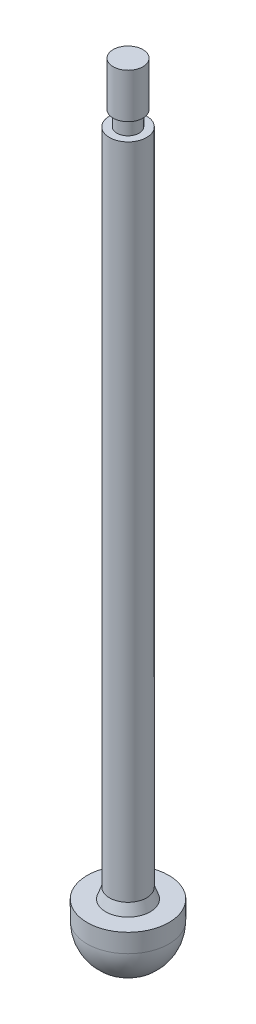
ISO-10303-21;
HEADER;
FILE_DESCRIPTION(('STEP AP214'),'2;1');
FILE_NAME('part.step','',(''),(''),'','','');
FILE_SCHEMA(('AUTOMOTIVE_DESIGN { 1 0 10303 214 1 1 1 1 }'));
ENDSEC;
DATA;
#1=APPLICATION_CONTEXT('core data for automotive mechanical design processes');
#2=APPLICATION_PROTOCOL_DEFINITION('international standard','automotive_design',2000,#1);
#3=PRODUCT_CONTEXT('',#1,'mechanical');
#4=PRODUCT('Part','Part','',(#3));
#5=PRODUCT_RELATED_PRODUCT_CATEGORY('part','',(#4));
#6=PRODUCT_DEFINITION_FORMATION('','',#4);
#7=PRODUCT_DEFINITION_CONTEXT('part definition',#1,'design');
#8=PRODUCT_DEFINITION('design','',#6,#7);
#9=PRODUCT_DEFINITION_SHAPE('','',#8);
#10=(LENGTH_UNIT() NAMED_UNIT(*) SI_UNIT(.MILLI.,.METRE.));
#11=(NAMED_UNIT(*) PLANE_ANGLE_UNIT() SI_UNIT($,.RADIAN.));
#12=(NAMED_UNIT(*) SI_UNIT($,.STERADIAN.) SOLID_ANGLE_UNIT());
#13=UNCERTAINTY_MEASURE_WITH_UNIT(LENGTH_MEASURE(1.E-05),#10,'distance_accuracy_value','');
#14=(GEOMETRIC_REPRESENTATION_CONTEXT(3) GLOBAL_UNCERTAINTY_ASSIGNED_CONTEXT((#13)) GLOBAL_UNIT_ASSIGNED_CONTEXT((#10,
#11,#12)) REPRESENTATION_CONTEXT('',''));
#15=CARTESIAN_POINT('',(0.,0.,0.));
#16=DIRECTION('',(0.,0.,1.));
#17=DIRECTION('',(1.,0.,0.));
#18=AXIS2_PLACEMENT_3D('',#15,#16,#17);
#19=CARTESIAN_POINT('',(0.,2.5,0.));
#20=DIRECTION('',(0.,-1.,0.));
#21=DIRECTION('',(0.,0.,-1.));
#22=AXIS2_PLACEMENT_3D('',#19,#20,#21);
#23=CONICAL_SURFACE('',#22,3.00000000000001,0.349065850398871);
#24=CARTESIAN_POINT('',(0.,3.87373870972729,0.));
#25=DIRECTION('',(0.,-1.,0.));
#26=DIRECTION('',(0.,0.,-1.));
#27=AXIS2_PLACEMENT_3D('',#24,#25,#26);
#28=CIRCLE('',#27,2.50000000000001);
#29=CARTESIAN_POINT('',(0.,3.87373870972729,-2.50000000000001));
#30=VERTEX_POINT('',#29);
#31=EDGE_CURVE('E10',#30,#30,#28,.T.);
#32=ORIENTED_EDGE('',*,*,#31,.T.);
#33=EDGE_LOOP('',(#32));
#34=FACE_BOUND('',#33,.T.);
#35=CARTESIAN_POINT('',(0.,2.5,0.));
#36=DIRECTION('',(0.,-1.,0.));
#37=DIRECTION('',(0.,0.,-1.));
#38=AXIS2_PLACEMENT_3D('',#35,#36,#37);
#39=CIRCLE('',#38,3.00000000000001);
#40=CARTESIAN_POINT('',(0.,2.5,-3.00000000000001));
#41=VERTEX_POINT('',#40);
#42=EDGE_CURVE('E64',#41,#41,#39,.T.);
#43=ORIENTED_EDGE('',*,*,#42,.F.);
#44=EDGE_LOOP('',(#43));
#45=FACE_BOUND('',#44,.T.);
#46=ADVANCED_FACE('F33',(#34,#45),#23,.T.);
#47=CARTESIAN_POINT('',(0.,0.,0.));
#48=DIRECTION('',(0.,-1.,0.));
#49=DIRECTION('',(0.,0.,-1.));
#50=AXIS2_PLACEMENT_3D('',#47,#48,#49);
#51=CYLINDRICAL_SURFACE('',#50,2.50000000000001);
#52=CARTESIAN_POINT('',(0.,92.5,0.));
#53=DIRECTION('',(0.,-1.,0.));
#54=DIRECTION('',(0.,0.,-1.));
#55=AXIS2_PLACEMENT_3D('',#52,#53,#54);
#56=CIRCLE('',#55,2.50000000000001);
#57=CARTESIAN_POINT('',(0.,92.5,-2.50000000000001));
#58=VERTEX_POINT('',#57);
#59=EDGE_CURVE('E39',#58,#58,#56,.T.);
#60=ORIENTED_EDGE('',*,*,#59,.T.);
#61=EDGE_LOOP('',(#60));
#62=FACE_BOUND('',#61,.T.);
#63=ORIENTED_EDGE('',*,*,#31,.F.);
#64=EDGE_LOOP('',(#63));
#65=FACE_BOUND('',#64,.T.);
#66=ADVANCED_FACE('F72',(#62,#65),#51,.T.);
#67=CARTESIAN_POINT('',(2.50000000000001,92.5,0.));
#68=DIRECTION('',(0.,1.,0.));
#69=DIRECTION('',(0.,0.,1.));
#70=AXIS2_PLACEMENT_3D('',#67,#68,#69);
#71=PLANE('',#70);
#72=CARTESIAN_POINT('',(0.,92.5,0.));
#73=DIRECTION('',(0.,-1.,0.));
#74=DIRECTION('',(0.,0.,-1.));
#75=AXIS2_PLACEMENT_3D('',#72,#73,#74);
#76=CIRCLE('',#75,1.5);
#77=CARTESIAN_POINT('',(0.,92.5,-1.5));
#78=VERTEX_POINT('',#77);
#79=EDGE_CURVE('E43',#78,#78,#76,.T.);
#80=ORIENTED_EDGE('',*,*,#79,.T.);
#81=EDGE_LOOP('',(#80));
#82=FACE_BOUND('',#81,.T.);
#83=ORIENTED_EDGE('',*,*,#59,.F.);
#84=EDGE_LOOP('',(#83));
#85=FACE_BOUND('',#84,.T.);
#86=ADVANCED_FACE('F76',(#82,#85),#71,.T.);
#87=CARTESIAN_POINT('',(0.,0.,0.));
#88=DIRECTION('',(0.,-1.,0.));
#89=DIRECTION('',(0.,0.,-1.));
#90=AXIS2_PLACEMENT_3D('',#87,#88,#89);
#91=CYLINDRICAL_SURFACE('',#90,1.5);
#92=CARTESIAN_POINT('',(0.,94.5,0.));
#93=DIRECTION('',(0.,-1.,0.));
#94=DIRECTION('',(0.,0.,-1.));
#95=AXIS2_PLACEMENT_3D('',#92,#93,#94);
#96=CIRCLE('',#95,1.5);
#97=CARTESIAN_POINT('',(0.,94.5,-1.5));
#98=VERTEX_POINT('',#97);
#99=EDGE_CURVE('E47',#98,#98,#96,.T.);
#100=ORIENTED_EDGE('',*,*,#99,.T.);
#101=EDGE_LOOP('',(#100));
#102=FACE_BOUND('',#101,.T.);
#103=ORIENTED_EDGE('',*,*,#79,.F.);
#104=EDGE_LOOP('',(#103));
#105=FACE_BOUND('',#104,.T.);
#106=ADVANCED_FACE('F80',(#102,#105),#91,.T.);
#107=CARTESIAN_POINT('',(1.5,94.5,0.));
#108=DIRECTION('',(0.,-1.,0.));
#109=DIRECTION('',(0.,0.,-1.));
#110=AXIS2_PLACEMENT_3D('',#107,#108,#109);
#111=PLANE('',#110);
#112=CARTESIAN_POINT('',(0.,94.5,0.));
#113=DIRECTION('',(0.,-1.,0.));
#114=DIRECTION('',(0.,0.,-1.));
#115=AXIS2_PLACEMENT_3D('',#112,#113,#114);
#116=CIRCLE('',#115,2.);
#117=CARTESIAN_POINT('',(0.,94.5,-2.));
#118=VERTEX_POINT('',#117);
#119=EDGE_CURVE('E52',#118,#118,#116,.T.);
#120=ORIENTED_EDGE('',*,*,#119,.T.);
#121=EDGE_LOOP('',(#120));
#122=FACE_BOUND('',#121,.T.);
#123=ORIENTED_EDGE('',*,*,#99,.F.);
#124=EDGE_LOOP('',(#123));
#125=FACE_BOUND('',#124,.T.);
#126=ADVANCED_FACE('F87',(#122,#125),#111,.T.);
#127=CARTESIAN_POINT('',(0.,0.,0.));
#128=DIRECTION('',(0.,-1.,0.));
#129=DIRECTION('',(0.,0.,-1.));
#130=AXIS2_PLACEMENT_3D('',#127,#128,#129);
#131=CYLINDRICAL_SURFACE('',#130,2.);
#132=CARTESIAN_POINT('',(0.,100.5,0.));
#133=DIRECTION('',(0.,-1.,0.));
#134=DIRECTION('',(0.,0.,-1.));
#135=AXIS2_PLACEMENT_3D('',#132,#133,#134);
#136=CIRCLE('',#135,2.);
#137=CARTESIAN_POINT('',(0.,100.5,-2.));
#138=VERTEX_POINT('',#137);
#139=EDGE_CURVE('E55',#138,#138,#136,.T.);
#140=ORIENTED_EDGE('',*,*,#139,.T.);
#141=EDGE_LOOP('',(#140));
#142=FACE_BOUND('',#141,.T.);
#143=ORIENTED_EDGE('',*,*,#119,.F.);
#144=EDGE_LOOP('',(#143));
#145=FACE_BOUND('',#144,.T.);
#146=ADVANCED_FACE('F91',(#142,#145),#131,.T.);
#147=CARTESIAN_POINT('',(2.,100.5,0.));
#148=DIRECTION('',(0.,1.,0.));
#149=DIRECTION('',(0.,0.,1.));
#150=AXIS2_PLACEMENT_3D('',#147,#148,#149);
#151=PLANE('',#150);
#152=ORIENTED_EDGE('',*,*,#139,.F.);
#153=EDGE_LOOP('',(#152));
#154=FACE_BOUND('',#153,.T.);
#155=ADVANCED_FACE('F95',(#154),#151,.T.);
#156=CARTESIAN_POINT('',(0.,0.,0.));
#157=DIRECTION('',(0.,-1.,0.));
#158=DIRECTION('',(-1.,0.,0.));
#159=AXIS2_PLACEMENT_3D('',#156,#157,#158);
#160=SPHERICAL_SURFACE('',#159,5.5);
#161=CARTESIAN_POINT('',(0.,0.,0.));
#162=DIRECTION('',(0.,-1.,0.));
#163=DIRECTION('',(0.,0.,-1.));
#164=AXIS2_PLACEMENT_3D('',#161,#162,#163);
#165=CIRCLE('',#164,5.5);
#166=CARTESIAN_POINT('',(0.,0.,-5.5));
#167=VERTEX_POINT('',#166);
#168=EDGE_CURVE('E58',#167,#167,#165,.T.);
#169=ORIENTED_EDGE('',*,*,#168,.T.);
#170=EDGE_LOOP('',(#169));
#171=FACE_BOUND('',#170,.T.);
#172=ADVANCED_FACE('F99',(#171),#160,.T.);
#173=CARTESIAN_POINT('',(0.,0.,0.));
#174=DIRECTION('',(0.,-1.,0.));
#175=DIRECTION('',(0.,0.,-1.));
#176=AXIS2_PLACEMENT_3D('',#173,#174,#175);
#177=CYLINDRICAL_SURFACE('',#176,5.5);
#178=CARTESIAN_POINT('',(0.,2.5,0.));
#179=DIRECTION('',(0.,-1.,0.));
#180=DIRECTION('',(0.,0.,-1.));
#181=AXIS2_PLACEMENT_3D('',#178,#179,#180);
#182=CIRCLE('',#181,5.5);
#183=CARTESIAN_POINT('',(0.,2.5,-5.5));
#184=VERTEX_POINT('',#183);
#185=EDGE_CURVE('E61',#184,#184,#182,.T.);
#186=ORIENTED_EDGE('',*,*,#185,.T.);
#187=EDGE_LOOP('',(#186));
#188=FACE_BOUND('',#187,.T.);
#189=ORIENTED_EDGE('',*,*,#168,.F.);
#190=EDGE_LOOP('',(#189));
#191=FACE_BOUND('',#190,.T.);
#192=ADVANCED_FACE('F103',(#188,#191),#177,.T.);
#193=CARTESIAN_POINT('',(5.5,2.5,0.));
#194=DIRECTION('',(0.,1.,0.));
#195=DIRECTION('',(0.,0.,1.));
#196=AXIS2_PLACEMENT_3D('',#193,#194,#195);
#197=PLANE('',#196);
#198=ORIENTED_EDGE('',*,*,#42,.T.);
#199=EDGE_LOOP('',(#198));
#200=FACE_BOUND('',#199,.T.);
#201=ORIENTED_EDGE('',*,*,#185,.F.);
#202=EDGE_LOOP('',(#201));
#203=FACE_BOUND('',#202,.T.);
#204=ADVANCED_FACE('F68',(#200,#203),#197,.T.);
#205=CLOSED_SHELL('',(#46,#66,#86,#106,#126,#146,#155,#172,#192,#204));
#206=MANIFOLD_SOLID_BREP('B2',#205);
#207=ADVANCED_BREP_SHAPE_REPRESENTATION('',(#18,#206),#14);
#208=SHAPE_DEFINITION_REPRESENTATION(#9,#207);
ENDSEC;
END-ISO-10303-21;
